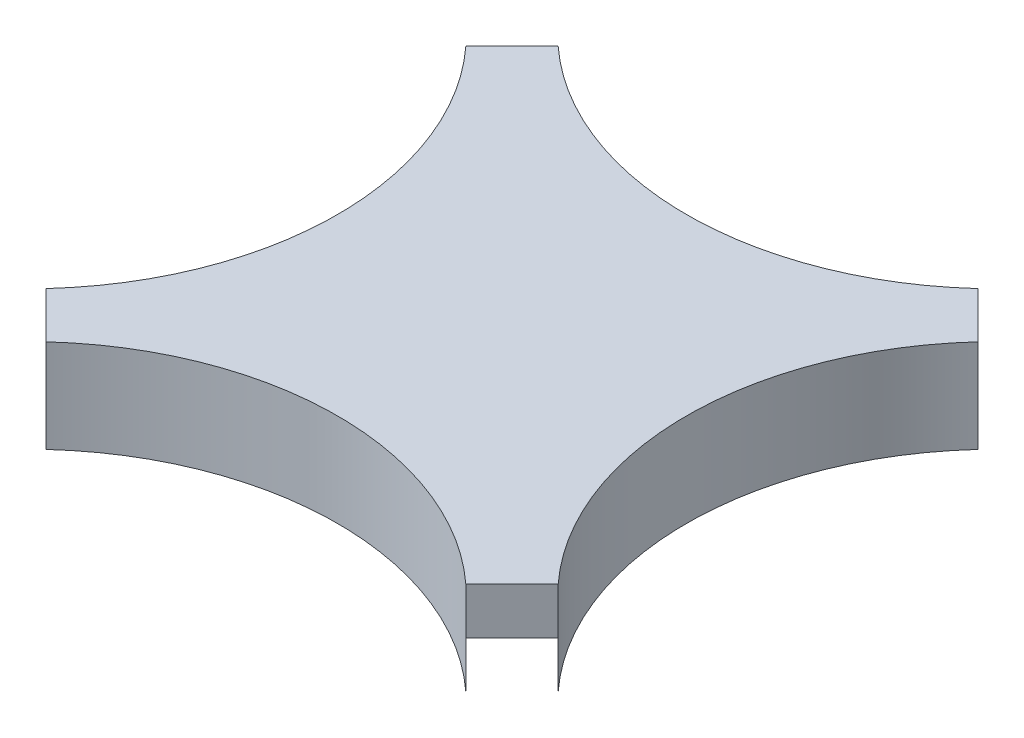
ISO-10303-21;
HEADER;
FILE_DESCRIPTION(('STEP AP214'),'2;1');
FILE_NAME('part.step','',(''),(''),'','','');
FILE_SCHEMA(('AUTOMOTIVE_DESIGN { 1 0 10303 214 1 1 1 1 }'));
ENDSEC;
DATA;
#1=APPLICATION_CONTEXT('core data for automotive mechanical design processes');
#2=APPLICATION_PROTOCOL_DEFINITION('international standard','automotive_design',2000,#1);
#3=PRODUCT_CONTEXT('',#1,'mechanical');
#4=PRODUCT('Part','Part','',(#3));
#5=PRODUCT_RELATED_PRODUCT_CATEGORY('part','',(#4));
#6=PRODUCT_DEFINITION_FORMATION('','',#4);
#7=PRODUCT_DEFINITION_CONTEXT('part definition',#1,'design');
#8=PRODUCT_DEFINITION('design','',#6,#7);
#9=PRODUCT_DEFINITION_SHAPE('','',#8);
#10=(LENGTH_UNIT() NAMED_UNIT(*) SI_UNIT(.MILLI.,.METRE.));
#11=(NAMED_UNIT(*) PLANE_ANGLE_UNIT() SI_UNIT($,.RADIAN.));
#12=(NAMED_UNIT(*) SI_UNIT($,.STERADIAN.) SOLID_ANGLE_UNIT());
#13=UNCERTAINTY_MEASURE_WITH_UNIT(LENGTH_MEASURE(1.E-05),#10,'distance_accuracy_value','');
#14=(GEOMETRIC_REPRESENTATION_CONTEXT(3) GLOBAL_UNCERTAINTY_ASSIGNED_CONTEXT((#13)) GLOBAL_UNIT_ASSIGNED_CONTEXT((#10,
#11,#12)) REPRESENTATION_CONTEXT('',''));
#15=CARTESIAN_POINT('',(0.,0.,0.));
#16=DIRECTION('',(0.,0.,1.));
#17=DIRECTION('',(1.,0.,0.));
#18=AXIS2_PLACEMENT_3D('',#15,#16,#17);
#19=CARTESIAN_POINT('',(-0.742462120245874,-1.5,-0.742462120245874));
#20=DIRECTION('',(0.707106781186548,0.,0.707106781186547));
#21=DIRECTION('',(0.707106781186547,0.,-0.707106781186548));
#22=AXIS2_PLACEMENT_3D('',#19,#20,#21);
#23=PLANE('',#22);
#24=DIRECTION('',(0.,1.,0.));
#25=VECTOR('',#24,1.);
#26=CARTESIAN_POINT('',(6.75753787975413,-1.5,-8.24246212024588));
#27=LINE('',#26,#25);
#28=CARTESIAN_POINT('',(6.75753787975413,-1.5,-8.24246212024588));
#29=VERTEX_POINT('',#28);
#30=CARTESIAN_POINT('',(6.75753787975413,0.,-8.24246212024588));
#31=VERTEX_POINT('',#30);
#32=EDGE_CURVE('E230',#29,#31,#27,.T.);
#33=ORIENTED_EDGE('',*,*,#32,.T.);
#34=DIRECTION('',(0.707106781186547,0.,-0.707106781186548));
#35=VECTOR('',#34,1.);
#36=CARTESIAN_POINT('',(-0.742462120245874,0.,-0.742462120245874));
#37=LINE('',#36,#35);
#38=CARTESIAN_POINT('',(2.27943567733269,0.,-3.76435991782444));
#39=VERTEX_POINT('',#38);
#40=EDGE_CURVE('E447',#39,#31,#37,.T.);
#41=ORIENTED_EDGE('',*,*,#40,.F.);
#42=DIRECTION('',(0.,1.,0.));
#43=VECTOR('',#42,1.);
#44=CARTESIAN_POINT('',(2.27943567733269,-1.5,-3.76435991782444));
#45=LINE('',#44,#43);
#46=CARTESIAN_POINT('',(2.27943567733269,-1.5,-3.76435991782444));
#47=VERTEX_POINT('',#46);
#48=EDGE_CURVE('E12',#47,#39,#45,.T.);
#49=ORIENTED_EDGE('',*,*,#48,.F.);
#50=DIRECTION('',(0.707106781186547,0.,-0.707106781186548));
#51=VECTOR('',#50,1.);
#52=CARTESIAN_POINT('',(-0.742462120245874,-1.5,-0.742462120245874));
#53=LINE('',#52,#51);
#54=EDGE_CURVE('E529',#47,#29,#53,.T.);
#55=ORIENTED_EDGE('',*,*,#54,.T.);
#56=EDGE_LOOP('',(#33,#41,#49,#55));
#57=FACE_BOUND('',#56,.T.);
#58=ADVANCED_FACE('F227',(#57),#23,.T.);
#59=CARTESIAN_POINT('',(0.,-1.5,-6.48588026367947));
#60=DIRECTION('',(0.,1.,0.));
#61=DIRECTION('',(0.,0.,1.));
#62=AXIS2_PLACEMENT_3D('',#59,#60,#61);
#63=CYLINDRICAL_SURFACE('',#62,3.55);
#64=CARTESIAN_POINT('',(0.,0.,-6.48588026367947));
#65=DIRECTION('',(0.,1.,0.));
#66=DIRECTION('',(0.,0.,1.));
#67=AXIS2_PLACEMENT_3D('',#64,#65,#66);
#68=CIRCLE('',#67,3.55);
#69=CARTESIAN_POINT('',(-2.27943567733269,0.,-3.76435991782444));
#70=VERTEX_POINT('',#69);
#71=EDGE_CURVE('E467',#39,#70,#68,.F.);
#72=ORIENTED_EDGE('',*,*,#71,.T.);
#73=DIRECTION('',(0.,1.,0.));
#74=VECTOR('',#73,1.);
#75=CARTESIAN_POINT('',(-2.27943567733269,-1.5,-3.76435991782444));
#76=LINE('',#75,#74);
#77=CARTESIAN_POINT('',(-2.27943567733269,-1.5,-3.76435991782444));
#78=VERTEX_POINT('',#77);
#79=EDGE_CURVE('E235',#78,#70,#76,.T.);
#80=ORIENTED_EDGE('',*,*,#79,.F.);
#81=CARTESIAN_POINT('',(0.,-1.5,-6.48588026367947));
#82=DIRECTION('',(0.,1.,0.));
#83=DIRECTION('',(0.,0.,1.));
#84=AXIS2_PLACEMENT_3D('',#81,#82,#83);
#85=CIRCLE('',#84,3.55);
#86=EDGE_CURVE('E248',#47,#78,#85,.F.);
#87=ORIENTED_EDGE('',*,*,#86,.F.);
#88=ORIENTED_EDGE('',*,*,#48,.T.);
#89=EDGE_LOOP('',(#72,#80,#87,#88));
#90=FACE_BOUND('',#89,.T.);
#91=ADVANCED_FACE('F556',(#90),#63,.T.);
#92=CARTESIAN_POINT('',(0.742462120245877,-1.5,-0.742462120245878));
#93=DIRECTION('',(-0.707106781186547,0.,0.707106781186548));
#94=DIRECTION('',(0.707106781186548,0.,0.707106781186547));
#95=AXIS2_PLACEMENT_3D('',#92,#93,#94);
#96=PLANE('',#95);
#97=ORIENTED_EDGE('',*,*,#79,.T.);
#98=DIRECTION('',(0.707106781186548,0.,0.707106781186547));
#99=VECTOR('',#98,1.);
#100=CARTESIAN_POINT('',(0.742462120245877,0.,-0.742462120245878));
#101=LINE('',#100,#99);
#102=CARTESIAN_POINT('',(-6.75753787975412,0.,-8.24246212024587));
#103=VERTEX_POINT('',#102);
#104=EDGE_CURVE('E470',#103,#70,#101,.T.);
#105=ORIENTED_EDGE('',*,*,#104,.F.);
#106=DIRECTION('',(0.,1.,0.));
#107=VECTOR('',#106,1.);
#108=CARTESIAN_POINT('',(-6.75753787975412,-1.5,-8.24246212024587));
#109=LINE('',#108,#107);
#110=CARTESIAN_POINT('',(-6.75753787975412,-1.5,-8.24246212024587));
#111=VERTEX_POINT('',#110);
#112=EDGE_CURVE('E539',#111,#103,#109,.T.);
#113=ORIENTED_EDGE('',*,*,#112,.F.);
#114=DIRECTION('',(0.707106781186548,0.,0.707106781186547));
#115=VECTOR('',#114,1.);
#116=CARTESIAN_POINT('',(0.742462120245877,-1.5,-0.742462120245878));
#117=LINE('',#116,#115);
#118=EDGE_CURVE('E534',#111,#78,#117,.T.);
#119=ORIENTED_EDGE('',*,*,#118,.T.);
#120=EDGE_LOOP('',(#97,#105,#113,#119));
#121=FACE_BOUND('',#120,.T.);
#122=ADVANCED_FACE('F549',(#121),#96,.T.);
#123=CARTESIAN_POINT('',(0.,-1.5,-15.6137362166072));
#124=DIRECTION('',(0.,1.,0.));
#125=DIRECTION('',(0.,0.,1.));
#126=AXIS2_PLACEMENT_3D('',#123,#124,#125);
#127=CYLINDRICAL_SURFACE('',#126,10.);
#128=ORIENTED_EDGE('',*,*,#112,.T.);
#129=DIRECTION('',(0.,-1.,0.));
#130=VECTOR('',#129,1.);
#131=CARTESIAN_POINT('',(-6.75753787975412,1.5,-8.24246212024587));
#132=LINE('',#131,#130);
#133=CARTESIAN_POINT('',(-6.75753787975412,1.5,-8.24246212024587));
#134=VERTEX_POINT('',#133);
#135=EDGE_CURVE('E524',#134,#103,#132,.T.);
#136=ORIENTED_EDGE('',*,*,#135,.F.);
#137=CARTESIAN_POINT('',(0.,1.5,-15.6137362166072));
#138=DIRECTION('',(0.,1.,0.));
#139=DIRECTION('',(0.,0.,1.));
#140=AXIS2_PLACEMENT_3D('',#137,#138,#139);
#141=CIRCLE('',#140,10.);
#142=CARTESIAN_POINT('',(6.75753787975413,1.5,-8.24246212024588));
#143=VERTEX_POINT('',#142);
#144=EDGE_CURVE('E526',#143,#134,#141,.F.);
#145=ORIENTED_EDGE('',*,*,#144,.F.);
#146=DIRECTION('',(0.,-1.,0.));
#147=VECTOR('',#146,1.);
#148=CARTESIAN_POINT('',(6.75753787975413,1.5,-8.24246212024588));
#149=LINE('',#148,#147);
#150=EDGE_CURVE('E465',#143,#31,#149,.T.);
#151=ORIENTED_EDGE('',*,*,#150,.T.);
#152=ORIENTED_EDGE('',*,*,#32,.F.);
#153=CARTESIAN_POINT('',(0.,-1.5,-15.6137362166072));
#154=DIRECTION('',(0.,1.,0.));
#155=DIRECTION('',(0.,0.,1.));
#156=AXIS2_PLACEMENT_3D('',#153,#154,#155);
#157=CIRCLE('',#156,10.);
#158=EDGE_CURVE('E531',#29,#111,#157,.F.);
#159=ORIENTED_EDGE('',*,*,#158,.T.);
#160=EDGE_LOOP('',(#128,#136,#145,#151,#152,#159));
#161=FACE_BOUND('',#160,.T.);
#162=ADVANCED_FACE('F545',(#161),#127,.F.);
#163=CARTESIAN_POINT('',(0.,-1.5,0.));
#164=DIRECTION('',(0.,1.,0.));
#165=DIRECTION('',(0.,0.,1.));
#166=AXIS2_PLACEMENT_3D('',#163,#164,#165);
#167=PLANE('',#166);
#168=ORIENTED_EDGE('',*,*,#54,.F.);
#169=ORIENTED_EDGE('',*,*,#86,.T.);
#170=ORIENTED_EDGE('',*,*,#118,.F.);
#171=ORIENTED_EDGE('',*,*,#158,.F.);
#172=EDGE_LOOP('',(#168,#169,#170,#171));
#173=FACE_BOUND('',#172,.T.);
#174=ADVANCED_FACE('F547',(#173),#167,.F.);
#175=CARTESIAN_POINT('',(0.,1.5,0.));
#176=DIRECTION('',(0.,1.,0.));
#177=DIRECTION('',(0.,0.,1.));
#178=AXIS2_PLACEMENT_3D('',#175,#176,#177);
#179=PLANE('',#178);
#180=DIRECTION('',(-0.707106781186547,0.,0.707106781186548));
#181=VECTOR('',#180,1.);
#182=CARTESIAN_POINT('',(7.50000000000001,1.5,7.5));
#183=LINE('',#182,#181);
#184=CARTESIAN_POINT('',(8.24246212024588,1.5,6.75753787975413));
#185=VERTEX_POINT('',#184);
#186=CARTESIAN_POINT('',(6.75753787975413,1.5,8.24246212024588));
#187=VERTEX_POINT('',#186);
#188=EDGE_CURVE('E461',#185,#187,#183,.T.);
#189=ORIENTED_EDGE('',*,*,#188,.F.);
#190=CARTESIAN_POINT('',(15.6137362166072,1.5,0.));
#191=DIRECTION('',(0.,1.,0.));
#192=DIRECTION('',(0.,0.,1.));
#193=AXIS2_PLACEMENT_3D('',#190,#191,#192);
#194=CIRCLE('',#193,10.);
#195=CARTESIAN_POINT('',(8.24246212024588,1.5,-6.75753787975413));
#196=VERTEX_POINT('',#195);
#197=EDGE_CURVE('E392',#185,#196,#194,.F.);
#198=ORIENTED_EDGE('',*,*,#197,.T.);
#199=DIRECTION('',(0.707106781186548,0.,0.707106781186547));
#200=VECTOR('',#199,1.);
#201=CARTESIAN_POINT('',(7.5,1.5,-7.50000000000001));
#202=LINE('',#201,#200);
#203=EDGE_CURVE('E463',#143,#196,#202,.T.);
#204=ORIENTED_EDGE('',*,*,#203,.F.);
#205=ORIENTED_EDGE('',*,*,#144,.T.);
#206=DIRECTION('',(0.707106781186548,0.,-0.707106781186548));
#207=VECTOR('',#206,1.);
#208=CARTESIAN_POINT('',(-7.5,1.5,-7.5));
#209=LINE('',#208,#207);
#210=CARTESIAN_POINT('',(-8.24246212024587,1.5,-6.75753787975412));
#211=VERTEX_POINT('',#210);
#212=EDGE_CURVE('E455',#211,#134,#209,.T.);
#213=ORIENTED_EDGE('',*,*,#212,.F.);
#214=CARTESIAN_POINT('',(-15.6137362166072,1.5,0.));
#215=DIRECTION('',(0.,1.,0.));
#216=DIRECTION('',(0.,0.,1.));
#217=AXIS2_PLACEMENT_3D('',#214,#215,#216);
#218=CIRCLE('',#217,10.);
#219=CARTESIAN_POINT('',(-8.24246212024587,1.5,6.75753787975413));
#220=VERTEX_POINT('',#219);
#221=EDGE_CURVE('E421',#211,#220,#218,.F.);
#222=ORIENTED_EDGE('',*,*,#221,.T.);
#223=DIRECTION('',(-0.707106781186548,0.,-0.707106781186547));
#224=VECTOR('',#223,1.);
#225=CARTESIAN_POINT('',(-7.5,1.5,7.5));
#226=LINE('',#225,#224);
#227=CARTESIAN_POINT('',(-6.75753787975412,1.5,8.24246212024588));
#228=VERTEX_POINT('',#227);
#229=EDGE_CURVE('E457',#228,#220,#226,.T.);
#230=ORIENTED_EDGE('',*,*,#229,.F.);
#231=CARTESIAN_POINT('',(0.,1.5,15.6137362166072));
#232=DIRECTION('',(0.,1.,0.));
#233=DIRECTION('',(0.,0.,1.));
#234=AXIS2_PLACEMENT_3D('',#231,#232,#233);
#235=CIRCLE('',#234,10.);
#236=EDGE_CURVE('E400',#228,#187,#235,.F.);
#237=ORIENTED_EDGE('',*,*,#236,.T.);
#238=EDGE_LOOP('',(#189,#198,#204,#205,#213,#222,#230,#237));
#239=FACE_BOUND('',#238,.T.);
#240=ADVANCED_FACE('F570',(#239),#179,.T.);
#241=CARTESIAN_POINT('',(-7.5,1.5,-7.5));
#242=DIRECTION('',(-0.707106781186547,0.,-0.707106781186547));
#243=DIRECTION('',(-0.707106781186548,0.,0.707106781186548));
#244=AXIS2_PLACEMENT_3D('',#241,#242,#243);
#245=PLANE('',#244);
#246=DIRECTION('',(0.707106781186548,0.,-0.707106781186548));
#247=VECTOR('',#246,1.);
#248=CARTESIAN_POINT('',(-7.5,0.,-7.5));
#249=LINE('',#248,#247);
#250=CARTESIAN_POINT('',(-8.24246212024587,0.,-6.75753787975412));
#251=VERTEX_POINT('',#250);
#252=EDGE_CURVE('E472',#251,#103,#249,.T.);
#253=ORIENTED_EDGE('',*,*,#252,.F.);
#254=DIRECTION('',(0.,-1.,0.));
#255=VECTOR('',#254,1.);
#256=CARTESIAN_POINT('',(-8.24246212024587,1.5,-6.75753787975412));
#257=LINE('',#256,#255);
#258=EDGE_CURVE('E522',#211,#251,#257,.T.);
#259=ORIENTED_EDGE('',*,*,#258,.F.);
#260=ORIENTED_EDGE('',*,*,#212,.T.);
#261=ORIENTED_EDGE('',*,*,#135,.T.);
#262=EDGE_LOOP('',(#253,#259,#260,#261));
#263=FACE_BOUND('',#262,.T.);
#264=ADVANCED_FACE('F574',(#263),#245,.T.);
#265=CARTESIAN_POINT('',(-7.5,1.5,7.5));
#266=DIRECTION('',(-0.707106781186547,0.,0.707106781186548));
#267=DIRECTION('',(0.707106781186548,0.,0.707106781186547));
#268=AXIS2_PLACEMENT_3D('',#265,#266,#267);
#269=PLANE('',#268);
#270=DIRECTION('',(-0.707106781186548,0.,-0.707106781186547));
#271=VECTOR('',#270,1.);
#272=CARTESIAN_POINT('',(-7.5,0.,7.5));
#273=LINE('',#272,#271);
#274=CARTESIAN_POINT('',(-6.75753787975412,0.,8.24246212024588));
#275=VERTEX_POINT('',#274);
#276=CARTESIAN_POINT('',(-8.24246212024587,0.,6.75753787975413));
#277=VERTEX_POINT('',#276);
#278=EDGE_CURVE('E483',#275,#277,#273,.T.);
#279=ORIENTED_EDGE('',*,*,#278,.F.);
#280=DIRECTION('',(0.,-1.,0.));
#281=VECTOR('',#280,1.);
#282=CARTESIAN_POINT('',(-6.75753787975412,1.5,8.24246212024588));
#283=LINE('',#282,#281);
#284=EDGE_CURVE('E516',#228,#275,#283,.T.);
#285=ORIENTED_EDGE('',*,*,#284,.F.);
#286=ORIENTED_EDGE('',*,*,#229,.T.);
#287=DIRECTION('',(0.,-1.,0.));
#288=VECTOR('',#287,1.);
#289=CARTESIAN_POINT('',(-8.24246212024587,1.5,6.75753787975413));
#290=LINE('',#289,#288);
#291=EDGE_CURVE('E519',#220,#277,#290,.T.);
#292=ORIENTED_EDGE('',*,*,#291,.T.);
#293=EDGE_LOOP('',(#279,#285,#286,#292));
#294=FACE_BOUND('',#293,.T.);
#295=ADVANCED_FACE('F579',(#294),#269,.T.);
#296=CARTESIAN_POINT('',(7.50000000000001,1.5,7.5));
#297=DIRECTION('',(0.707106781186548,0.,0.707106781186547));
#298=DIRECTION('',(0.707106781186547,0.,-0.707106781186548));
#299=AXIS2_PLACEMENT_3D('',#296,#297,#298);
#300=PLANE('',#299);
#301=DIRECTION('',(-0.707106781186547,0.,0.707106781186548));
#302=VECTOR('',#301,1.);
#303=CARTESIAN_POINT('',(7.50000000000001,0.,7.5));
#304=LINE('',#303,#302);
#305=CARTESIAN_POINT('',(8.24246212024588,0.,6.75753787975413));
#306=VERTEX_POINT('',#305);
#307=CARTESIAN_POINT('',(6.75753787975413,0.,8.24246212024588));
#308=VERTEX_POINT('',#307);
#309=EDGE_CURVE('E495',#306,#308,#304,.T.);
#310=ORIENTED_EDGE('',*,*,#309,.F.);
#311=DIRECTION('',(0.,-1.,0.));
#312=VECTOR('',#311,1.);
#313=CARTESIAN_POINT('',(8.24246212024588,1.5,6.75753787975413));
#314=LINE('',#313,#312);
#315=EDGE_CURVE('E373',#185,#306,#314,.T.);
#316=ORIENTED_EDGE('',*,*,#315,.F.);
#317=ORIENTED_EDGE('',*,*,#188,.T.);
#318=DIRECTION('',(0.,-1.,0.));
#319=VECTOR('',#318,1.);
#320=CARTESIAN_POINT('',(6.75753787975413,1.5,8.24246212024588));
#321=LINE('',#320,#319);
#322=EDGE_CURVE('E513',#187,#308,#321,.T.);
#323=ORIENTED_EDGE('',*,*,#322,.T.);
#324=EDGE_LOOP('',(#310,#316,#317,#323));
#325=FACE_BOUND('',#324,.T.);
#326=ADVANCED_FACE('F586',(#325),#300,.T.);
#327=CARTESIAN_POINT('',(7.5,1.5,-7.50000000000001));
#328=DIRECTION('',(0.707106781186547,0.,-0.707106781186548));
#329=DIRECTION('',(-0.707106781186548,0.,-0.707106781186547));
#330=AXIS2_PLACEMENT_3D('',#327,#328,#329);
#331=PLANE('',#330);
#332=DIRECTION('',(0.707106781186548,0.,0.707106781186547));
#333=VECTOR('',#332,1.);
#334=CARTESIAN_POINT('',(7.5,0.,-7.50000000000001));
#335=LINE('',#334,#333);
#336=CARTESIAN_POINT('',(8.24246212024588,0.,-6.75753787975413));
#337=VERTEX_POINT('',#336);
#338=EDGE_CURVE('E458',#31,#337,#335,.T.);
#339=ORIENTED_EDGE('',*,*,#338,.F.);
#340=ORIENTED_EDGE('',*,*,#150,.F.);
#341=ORIENTED_EDGE('',*,*,#203,.T.);
#342=DIRECTION('',(0.,-1.,0.));
#343=VECTOR('',#342,1.);
#344=CARTESIAN_POINT('',(8.24246212024588,1.5,-6.75753787975413));
#345=LINE('',#344,#343);
#346=EDGE_CURVE('E509',#196,#337,#345,.T.);
#347=ORIENTED_EDGE('',*,*,#346,.T.);
#348=EDGE_LOOP('',(#339,#340,#341,#347));
#349=FACE_BOUND('',#348,.T.);
#350=ADVANCED_FACE('F590',(#349),#331,.T.);
#351=CARTESIAN_POINT('',(0.,0.,0.));
#352=DIRECTION('',(0.,1.,0.));
#353=DIRECTION('',(0.,0.,1.));
#354=AXIS2_PLACEMENT_3D('',#351,#352,#353);
#355=PLANE('',#354);
#356=ORIENTED_EDGE('',*,*,#40,.T.);
#357=ORIENTED_EDGE('',*,*,#338,.T.);
#358=DIRECTION('',(0.707106781186547,0.,-0.707106781186548));
#359=VECTOR('',#358,1.);
#360=CARTESIAN_POINT('',(0.742462120245877,0.,0.742462120245877));
#361=LINE('',#360,#359);
#362=CARTESIAN_POINT('',(3.76435991782444,0.,-2.27943567733269));
#363=VERTEX_POINT('',#362);
#364=EDGE_CURVE('E503',#363,#337,#361,.T.);
#365=ORIENTED_EDGE('',*,*,#364,.F.);
#366=CARTESIAN_POINT('',(6.48588026367947,0.,0.));
#367=DIRECTION('',(0.,1.,0.));
#368=DIRECTION('',(0.,0.,1.));
#369=AXIS2_PLACEMENT_3D('',#366,#367,#368);
#370=CIRCLE('',#369,3.55);
#371=CARTESIAN_POINT('',(3.76435991782444,0.,2.27943567733269));
#372=VERTEX_POINT('',#371);
#373=EDGE_CURVE('E500',#372,#363,#370,.F.);
#374=ORIENTED_EDGE('',*,*,#373,.F.);
#375=DIRECTION('',(0.707106781186548,0.,0.707106781186547));
#376=VECTOR('',#375,1.);
#377=CARTESIAN_POINT('',(0.742462120245875,0.,-0.742462120245875));
#378=LINE('',#377,#376);
#379=EDGE_CURVE('E497',#372,#306,#378,.T.);
#380=ORIENTED_EDGE('',*,*,#379,.T.);
#381=ORIENTED_EDGE('',*,*,#309,.T.);
#382=DIRECTION('',(0.707106781186548,0.,0.707106781186547));
#383=VECTOR('',#382,1.);
#384=CARTESIAN_POINT('',(-0.742462120245876,0.,0.742462120245876));
#385=LINE('',#384,#383);
#386=CARTESIAN_POINT('',(2.27943567733269,0.,3.76435991782444));
#387=VERTEX_POINT('',#386);
#388=EDGE_CURVE('E492',#387,#308,#385,.T.);
#389=ORIENTED_EDGE('',*,*,#388,.F.);
#390=CARTESIAN_POINT('',(0.,0.,6.48588026367947));
#391=DIRECTION('',(0.,1.,0.));
#392=DIRECTION('',(0.,0.,1.));
#393=AXIS2_PLACEMENT_3D('',#390,#391,#392);
#394=CIRCLE('',#393,3.55);
#395=CARTESIAN_POINT('',(-2.27943567733269,0.,3.76435991782444));
#396=VERTEX_POINT('',#395);
#397=EDGE_CURVE('E489',#396,#387,#394,.F.);
#398=ORIENTED_EDGE('',*,*,#397,.F.);
#399=DIRECTION('',(0.707106781186547,0.,-0.707106781186548));
#400=VECTOR('',#399,1.);
#401=CARTESIAN_POINT('',(0.742462120245874,0.,0.742462120245874));
#402=LINE('',#401,#400);
#403=EDGE_CURVE('E486',#275,#396,#402,.T.);
#404=ORIENTED_EDGE('',*,*,#403,.F.);
#405=ORIENTED_EDGE('',*,*,#278,.T.);
#406=DIRECTION('',(0.707106781186547,0.,-0.707106781186548));
#407=VECTOR('',#406,1.);
#408=CARTESIAN_POINT('',(-0.742462120245876,0.,-0.742462120245876));
#409=LINE('',#408,#407);
#410=CARTESIAN_POINT('',(-3.76435991782444,0.,2.27943567733269));
#411=VERTEX_POINT('',#410);
#412=EDGE_CURVE('E480',#277,#411,#409,.T.);
#413=ORIENTED_EDGE('',*,*,#412,.T.);
#414=CARTESIAN_POINT('',(-6.48588026367946,0.,0.));
#415=DIRECTION('',(0.,1.,0.));
#416=DIRECTION('',(0.,0.,1.));
#417=AXIS2_PLACEMENT_3D('',#414,#415,#416);
#418=CIRCLE('',#417,3.55);
#419=CARTESIAN_POINT('',(-3.76435991782444,0.,-2.27943567733269));
#420=VERTEX_POINT('',#419);
#421=EDGE_CURVE('E477',#420,#411,#418,.F.);
#422=ORIENTED_EDGE('',*,*,#421,.F.);
#423=DIRECTION('',(0.707106781186548,0.,0.707106781186547));
#424=VECTOR('',#423,1.);
#425=CARTESIAN_POINT('',(-0.742462120245873,0.,0.742462120245874));
#426=LINE('',#425,#424);
#427=EDGE_CURVE('E475',#251,#420,#426,.T.);
#428=ORIENTED_EDGE('',*,*,#427,.F.);
#429=ORIENTED_EDGE('',*,*,#252,.T.);
#430=ORIENTED_EDGE('',*,*,#104,.T.);
#431=ORIENTED_EDGE('',*,*,#71,.F.);
#432=EDGE_LOOP('',(#356,#357,#365,#374,#380,#381,#389,#398,#404,#405,#413,#422,#428,#429,#430,#431));
#433=FACE_BOUND('',#432,.T.);
#434=ADVANCED_FACE('F552',(#433),#355,.F.);
#435=CARTESIAN_POINT('',(-0.742462120245873,-1.5,0.742462120245874));
#436=DIRECTION('',(-0.707106781186547,0.,0.707106781186548));
#437=DIRECTION('',(0.707106781186548,0.,0.707106781186547));
#438=AXIS2_PLACEMENT_3D('',#435,#436,#437);
#439=PLANE('',#438);
#440=DIRECTION('',(0.,1.,0.));
#441=VECTOR('',#440,1.);
#442=CARTESIAN_POINT('',(-8.24246212024587,-1.5,-6.75753787975412));
#443=LINE('',#442,#441);
#444=CARTESIAN_POINT('',(-8.24246212024587,-1.5,-6.75753787975412));
#445=VERTEX_POINT('',#444);
#446=EDGE_CURVE('E443',#445,#251,#443,.T.);
#447=ORIENTED_EDGE('',*,*,#446,.T.);
#448=ORIENTED_EDGE('',*,*,#427,.T.);
#449=DIRECTION('',(0.,1.,0.));
#450=VECTOR('',#449,1.);
#451=CARTESIAN_POINT('',(-3.76435991782444,-1.5,-2.27943567733269));
#452=LINE('',#451,#450);
#453=CARTESIAN_POINT('',(-3.76435991782444,-1.5,-2.27943567733269));
#454=VERTEX_POINT('',#453);
#455=EDGE_CURVE('E444',#454,#420,#452,.T.);
#456=ORIENTED_EDGE('',*,*,#455,.F.);
#457=DIRECTION('',(0.707106781186548,0.,0.707106781186547));
#458=VECTOR('',#457,1.);
#459=CARTESIAN_POINT('',(-0.742462120245873,-1.5,0.742462120245874));
#460=LINE('',#459,#458);
#461=EDGE_CURVE('E432',#445,#454,#460,.T.);
#462=ORIENTED_EDGE('',*,*,#461,.F.);
#463=EDGE_LOOP('',(#447,#448,#456,#462));
#464=FACE_BOUND('',#463,.T.);
#465=ADVANCED_FACE('F597',(#464),#439,.F.);
#466=CARTESIAN_POINT('',(-6.48588026367946,-1.5,0.));
#467=DIRECTION('',(0.,1.,0.));
#468=DIRECTION('',(0.,0.,1.));
#469=AXIS2_PLACEMENT_3D('',#466,#467,#468);
#470=CYLINDRICAL_SURFACE('',#469,3.55);
#471=ORIENTED_EDGE('',*,*,#455,.T.);
#472=ORIENTED_EDGE('',*,*,#421,.T.);
#473=DIRECTION('',(0.,1.,0.));
#474=VECTOR('',#473,1.);
#475=CARTESIAN_POINT('',(-3.76435991782444,-1.5,2.27943567733269));
#476=LINE('',#475,#474);
#477=CARTESIAN_POINT('',(-3.76435991782444,-1.5,2.27943567733269));
#478=VERTEX_POINT('',#477);
#479=EDGE_CURVE('E448',#478,#411,#476,.T.);
#480=ORIENTED_EDGE('',*,*,#479,.F.);
#481=CARTESIAN_POINT('',(-6.48588026367946,-1.5,0.));
#482=DIRECTION('',(0.,1.,0.));
#483=DIRECTION('',(0.,0.,1.));
#484=AXIS2_PLACEMENT_3D('',#481,#482,#483);
#485=CIRCLE('',#484,3.55);
#486=EDGE_CURVE('E441',#454,#478,#485,.F.);
#487=ORIENTED_EDGE('',*,*,#486,.F.);
#488=EDGE_LOOP('',(#471,#472,#480,#487));
#489=FACE_BOUND('',#488,.T.);
#490=ADVANCED_FACE('F600',(#489),#470,.T.);
#491=CARTESIAN_POINT('',(-0.742462120245876,-1.5,-0.742462120245876));
#492=DIRECTION('',(0.707106781186548,0.,0.707106781186547));
#493=DIRECTION('',(0.707106781186547,0.,-0.707106781186548));
#494=AXIS2_PLACEMENT_3D('',#491,#492,#493);
#495=PLANE('',#494);
#496=ORIENTED_EDGE('',*,*,#412,.F.);
#497=DIRECTION('',(0.,1.,0.));
#498=VECTOR('',#497,1.);
#499=CARTESIAN_POINT('',(-8.24246212024587,-1.5,6.75753787975413));
#500=LINE('',#499,#498);
#501=CARTESIAN_POINT('',(-8.24246212024587,-1.5,6.75753787975413));
#502=VERTEX_POINT('',#501);
#503=EDGE_CURVE('E450',#502,#277,#500,.T.);
#504=ORIENTED_EDGE('',*,*,#503,.F.);
#505=DIRECTION('',(0.707106781186547,0.,-0.707106781186548));
#506=VECTOR('',#505,1.);
#507=CARTESIAN_POINT('',(-0.742462120245876,-1.5,-0.742462120245876));
#508=LINE('',#507,#506);
#509=EDGE_CURVE('E438',#502,#478,#508,.T.);
#510=ORIENTED_EDGE('',*,*,#509,.T.);
#511=ORIENTED_EDGE('',*,*,#479,.T.);
#512=EDGE_LOOP('',(#496,#504,#510,#511));
#513=FACE_BOUND('',#512,.T.);
#514=ADVANCED_FACE('F606',(#513),#495,.T.);
#515=CARTESIAN_POINT('',(-15.6137362166072,-1.5,0.));
#516=DIRECTION('',(0.,1.,0.));
#517=DIRECTION('',(0.,0.,1.));
#518=AXIS2_PLACEMENT_3D('',#515,#516,#517);
#519=CYLINDRICAL_SURFACE('',#518,10.);
#520=ORIENTED_EDGE('',*,*,#503,.T.);
#521=ORIENTED_EDGE('',*,*,#291,.F.);
#522=ORIENTED_EDGE('',*,*,#221,.F.);
#523=ORIENTED_EDGE('',*,*,#258,.T.);
#524=ORIENTED_EDGE('',*,*,#446,.F.);
#525=CARTESIAN_POINT('',(-15.6137362166072,-1.5,0.));
#526=DIRECTION('',(0.,1.,0.));
#527=DIRECTION('',(0.,0.,1.));
#528=AXIS2_PLACEMENT_3D('',#525,#526,#527);
#529=CIRCLE('',#528,10.);
#530=EDGE_CURVE('E435',#445,#502,#529,.F.);
#531=ORIENTED_EDGE('',*,*,#530,.T.);
#532=EDGE_LOOP('',(#520,#521,#522,#523,#524,#531));
#533=FACE_BOUND('',#532,.T.);
#534=ADVANCED_FACE('F602',(#533),#519,.F.);
#535=CARTESIAN_POINT('',(0.,-1.5,0.));
#536=DIRECTION('',(0.,1.,0.));
#537=DIRECTION('',(0.,0.,1.));
#538=AXIS2_PLACEMENT_3D('',#535,#536,#537);
#539=PLANE('',#538);
#540=ORIENTED_EDGE('',*,*,#461,.T.);
#541=ORIENTED_EDGE('',*,*,#486,.T.);
#542=ORIENTED_EDGE('',*,*,#509,.F.);
#543=ORIENTED_EDGE('',*,*,#530,.F.);
#544=EDGE_LOOP('',(#540,#541,#542,#543));
#545=FACE_BOUND('',#544,.T.);
#546=ADVANCED_FACE('F605',(#545),#539,.F.);
#547=CARTESIAN_POINT('',(0.742462120245874,-1.5,0.742462120245874));
#548=DIRECTION('',(0.707106781186548,0.,0.707106781186547));
#549=DIRECTION('',(0.707106781186547,0.,-0.707106781186548));
#550=AXIS2_PLACEMENT_3D('',#547,#548,#549);
#551=PLANE('',#550);
#552=DIRECTION('',(0.,1.,0.));
#553=VECTOR('',#552,1.);
#554=CARTESIAN_POINT('',(-6.75753787975412,-1.5,8.24246212024588));
#555=LINE('',#554,#553);
#556=CARTESIAN_POINT('',(-6.75753787975412,-1.5,8.24246212024588));
#557=VERTEX_POINT('',#556);
#558=EDGE_CURVE('E417',#557,#275,#555,.T.);
#559=ORIENTED_EDGE('',*,*,#558,.T.);
#560=ORIENTED_EDGE('',*,*,#403,.T.);
#561=DIRECTION('',(0.,1.,0.));
#562=VECTOR('',#561,1.);
#563=CARTESIAN_POINT('',(-2.27943567733269,-1.5,3.76435991782444));
#564=LINE('',#563,#562);
#565=CARTESIAN_POINT('',(-2.27943567733269,-1.5,3.76435991782444));
#566=VERTEX_POINT('',#565);
#567=EDGE_CURVE('E418',#566,#396,#564,.T.);
#568=ORIENTED_EDGE('',*,*,#567,.F.);
#569=DIRECTION('',(0.707106781186547,0.,-0.707106781186548));
#570=VECTOR('',#569,1.);
#571=CARTESIAN_POINT('',(0.742462120245874,-1.5,0.742462120245874));
#572=LINE('',#571,#570);
#573=EDGE_CURVE('E407',#557,#566,#572,.T.);
#574=ORIENTED_EDGE('',*,*,#573,.F.);
#575=EDGE_LOOP('',(#559,#560,#568,#574));
#576=FACE_BOUND('',#575,.T.);
#577=ADVANCED_FACE('F616',(#576),#551,.F.);
#578=CARTESIAN_POINT('',(0.,-1.5,6.48588026367947));
#579=DIRECTION('',(0.,1.,0.));
#580=DIRECTION('',(0.,0.,1.));
#581=AXIS2_PLACEMENT_3D('',#578,#579,#580);
#582=CYLINDRICAL_SURFACE('',#581,3.55);
#583=ORIENTED_EDGE('',*,*,#567,.T.);
#584=ORIENTED_EDGE('',*,*,#397,.T.);
#585=DIRECTION('',(0.,1.,0.));
#586=VECTOR('',#585,1.);
#587=CARTESIAN_POINT('',(2.27943567733269,-1.5,3.76435991782444));
#588=LINE('',#587,#586);
#589=CARTESIAN_POINT('',(2.27943567733269,-1.5,3.76435991782444));
#590=VERTEX_POINT('',#589);
#591=EDGE_CURVE('E422',#590,#387,#588,.T.);
#592=ORIENTED_EDGE('',*,*,#591,.F.);
#593=CARTESIAN_POINT('',(0.,-1.5,6.48588026367947));
#594=DIRECTION('',(0.,1.,0.));
#595=DIRECTION('',(0.,0.,1.));
#596=AXIS2_PLACEMENT_3D('',#593,#594,#595);
#597=CIRCLE('',#596,3.55);
#598=EDGE_CURVE('E415',#566,#590,#597,.F.);
#599=ORIENTED_EDGE('',*,*,#598,.F.);
#600=EDGE_LOOP('',(#583,#584,#592,#599));
#601=FACE_BOUND('',#600,.T.);
#602=ADVANCED_FACE('F620',(#601),#582,.T.);
#603=CARTESIAN_POINT('',(-0.742462120245876,-1.5,0.742462120245876));
#604=DIRECTION('',(-0.707106781186547,0.,0.707106781186548));
#605=DIRECTION('',(0.707106781186548,0.,0.707106781186547));
#606=AXIS2_PLACEMENT_3D('',#603,#604,#605);
#607=PLANE('',#606);
#608=ORIENTED_EDGE('',*,*,#591,.T.);
#609=ORIENTED_EDGE('',*,*,#388,.T.);
#610=DIRECTION('',(0.,1.,0.));
#611=VECTOR('',#610,1.);
#612=CARTESIAN_POINT('',(6.75753787975413,-1.5,8.24246212024588));
#613=LINE('',#612,#611);
#614=CARTESIAN_POINT('',(6.75753787975413,-1.5,8.24246212024588));
#615=VERTEX_POINT('',#614);
#616=EDGE_CURVE('E425',#615,#308,#613,.T.);
#617=ORIENTED_EDGE('',*,*,#616,.F.);
#618=DIRECTION('',(0.707106781186548,0.,0.707106781186547));
#619=VECTOR('',#618,1.);
#620=CARTESIAN_POINT('',(-0.742462120245876,-1.5,0.742462120245876));
#621=LINE('',#620,#619);
#622=EDGE_CURVE('E413',#590,#615,#621,.T.);
#623=ORIENTED_EDGE('',*,*,#622,.F.);
#624=EDGE_LOOP('',(#608,#609,#617,#623));
#625=FACE_BOUND('',#624,.T.);
#626=ADVANCED_FACE('F626',(#625),#607,.F.);
#627=CARTESIAN_POINT('',(0.,-1.5,15.6137362166072));
#628=DIRECTION('',(0.,1.,0.));
#629=DIRECTION('',(0.,0.,1.));
#630=AXIS2_PLACEMENT_3D('',#627,#628,#629);
#631=CYLINDRICAL_SURFACE('',#630,10.);
#632=ORIENTED_EDGE('',*,*,#616,.T.);
#633=ORIENTED_EDGE('',*,*,#322,.F.);
#634=ORIENTED_EDGE('',*,*,#236,.F.);
#635=ORIENTED_EDGE('',*,*,#284,.T.);
#636=ORIENTED_EDGE('',*,*,#558,.F.);
#637=CARTESIAN_POINT('',(0.,-1.5,15.6137362166072));
#638=DIRECTION('',(0.,1.,0.));
#639=DIRECTION('',(0.,0.,1.));
#640=AXIS2_PLACEMENT_3D('',#637,#638,#639);
#641=CIRCLE('',#640,10.);
#642=EDGE_CURVE('E410',#557,#615,#641,.F.);
#643=ORIENTED_EDGE('',*,*,#642,.T.);
#644=EDGE_LOOP('',(#632,#633,#634,#635,#636,#643));
#645=FACE_BOUND('',#644,.T.);
#646=ADVANCED_FACE('F622',(#645),#631,.F.);
#647=CARTESIAN_POINT('',(0.,-1.5,0.));
#648=DIRECTION('',(0.,1.,0.));
#649=DIRECTION('',(0.,0.,1.));
#650=AXIS2_PLACEMENT_3D('',#647,#648,#649);
#651=PLANE('',#650);
#652=ORIENTED_EDGE('',*,*,#573,.T.);
#653=ORIENTED_EDGE('',*,*,#598,.T.);
#654=ORIENTED_EDGE('',*,*,#622,.T.);
#655=ORIENTED_EDGE('',*,*,#642,.F.);
#656=EDGE_LOOP('',(#652,#653,#654,#655));
#657=FACE_BOUND('',#656,.T.);
#658=ADVANCED_FACE('F625',(#657),#651,.F.);
#659=CARTESIAN_POINT('',(0.742462120245875,-1.5,-0.742462120245875));
#660=DIRECTION('',(-0.707106781186547,0.,0.707106781186548));
#661=DIRECTION('',(0.707106781186548,0.,0.707106781186547));
#662=AXIS2_PLACEMENT_3D('',#659,#660,#661);
#663=PLANE('',#662);
#664=ORIENTED_EDGE('',*,*,#379,.F.);
#665=DIRECTION('',(0.,1.,0.));
#666=VECTOR('',#665,1.);
#667=CARTESIAN_POINT('',(3.76435991782444,-1.5,2.27943567733269));
#668=LINE('',#667,#666);
#669=CARTESIAN_POINT('',(3.76435991782444,-1.5,2.27943567733269));
#670=VERTEX_POINT('',#669);
#671=EDGE_CURVE('E390',#670,#372,#668,.T.);
#672=ORIENTED_EDGE('',*,*,#671,.F.);
#673=DIRECTION('',(0.707106781186548,0.,0.707106781186547));
#674=VECTOR('',#673,1.);
#675=CARTESIAN_POINT('',(0.742462120245875,-1.5,-0.742462120245875));
#676=LINE('',#675,#674);
#677=CARTESIAN_POINT('',(8.24246212024588,-1.5,6.75753787975413));
#678=VERTEX_POINT('',#677);
#679=EDGE_CURVE('E383',#670,#678,#676,.T.);
#680=ORIENTED_EDGE('',*,*,#679,.T.);
#681=DIRECTION('',(0.,1.,0.));
#682=VECTOR('',#681,1.);
#683=CARTESIAN_POINT('',(8.24246212024588,-1.5,6.75753787975413));
#684=LINE('',#683,#682);
#685=EDGE_CURVE('E367',#678,#306,#684,.T.);
#686=ORIENTED_EDGE('',*,*,#685,.T.);
#687=EDGE_LOOP('',(#664,#672,#680,#686));
#688=FACE_BOUND('',#687,.T.);
#689=ADVANCED_FACE('F388',(#688),#663,.T.);
#690=CARTESIAN_POINT('',(6.48588026367947,-1.5,0.));
#691=DIRECTION('',(0.,1.,0.));
#692=DIRECTION('',(0.,0.,1.));
#693=AXIS2_PLACEMENT_3D('',#690,#691,#692);
#694=CYLINDRICAL_SURFACE('',#693,3.55);
#695=ORIENTED_EDGE('',*,*,#671,.T.);
#696=ORIENTED_EDGE('',*,*,#373,.T.);
#697=DIRECTION('',(0.,1.,0.));
#698=VECTOR('',#697,1.);
#699=CARTESIAN_POINT('',(3.76435991782444,-1.5,-2.27943567733269));
#700=LINE('',#699,#698);
#701=CARTESIAN_POINT('',(3.76435991782444,-1.5,-2.27943567733269));
#702=VERTEX_POINT('',#701);
#703=EDGE_CURVE('E401',#702,#363,#700,.T.);
#704=ORIENTED_EDGE('',*,*,#703,.F.);
#705=CARTESIAN_POINT('',(6.48588026367947,-1.5,0.));
#706=DIRECTION('',(0.,1.,0.));
#707=DIRECTION('',(0.,0.,1.));
#708=AXIS2_PLACEMENT_3D('',#705,#706,#707);
#709=CIRCLE('',#708,3.55);
#710=EDGE_CURVE('E378',#670,#702,#709,.F.);
#711=ORIENTED_EDGE('',*,*,#710,.F.);
#712=EDGE_LOOP('',(#695,#696,#704,#711));
#713=FACE_BOUND('',#712,.T.);
#714=ADVANCED_FACE('F639',(#713),#694,.T.);
#715=CARTESIAN_POINT('',(0.742462120245877,-1.5,0.742462120245877));
#716=DIRECTION('',(0.707106781186548,0.,0.707106781186547));
#717=DIRECTION('',(0.707106781186547,0.,-0.707106781186548));
#718=AXIS2_PLACEMENT_3D('',#715,#716,#717);
#719=PLANE('',#718);
#720=ORIENTED_EDGE('',*,*,#703,.T.);
#721=ORIENTED_EDGE('',*,*,#364,.T.);
#722=DIRECTION('',(0.,1.,0.));
#723=VECTOR('',#722,1.);
#724=CARTESIAN_POINT('',(8.24246212024588,-1.5,-6.75753787975413));
#725=LINE('',#724,#723);
#726=CARTESIAN_POINT('',(8.24246212024588,-1.5,-6.75753787975413));
#727=VERTEX_POINT('',#726);
#728=EDGE_CURVE('E377',#727,#337,#725,.T.);
#729=ORIENTED_EDGE('',*,*,#728,.F.);
#730=DIRECTION('',(0.707106781186547,0.,-0.707106781186548));
#731=VECTOR('',#730,1.);
#732=CARTESIAN_POINT('',(0.742462120245877,-1.5,0.742462120245877));
#733=LINE('',#732,#731);
#734=EDGE_CURVE('E385',#702,#727,#733,.T.);
#735=ORIENTED_EDGE('',*,*,#734,.F.);
#736=EDGE_LOOP('',(#720,#721,#729,#735));
#737=FACE_BOUND('',#736,.T.);
#738=ADVANCED_FACE('F642',(#737),#719,.F.);
#739=CARTESIAN_POINT('',(15.6137362166072,-1.5,0.));
#740=DIRECTION('',(0.,1.,0.));
#741=DIRECTION('',(0.,0.,1.));
#742=AXIS2_PLACEMENT_3D('',#739,#740,#741);
#743=CYLINDRICAL_SURFACE('',#742,10.);
#744=ORIENTED_EDGE('',*,*,#728,.T.);
#745=ORIENTED_EDGE('',*,*,#346,.F.);
#746=ORIENTED_EDGE('',*,*,#197,.F.);
#747=ORIENTED_EDGE('',*,*,#315,.T.);
#748=ORIENTED_EDGE('',*,*,#685,.F.);
#749=CARTESIAN_POINT('',(15.6137362166072,-1.5,0.));
#750=DIRECTION('',(0.,1.,0.));
#751=DIRECTION('',(0.,0.,1.));
#752=AXIS2_PLACEMENT_3D('',#749,#750,#751);
#753=CIRCLE('',#752,10.);
#754=EDGE_CURVE('E371',#678,#727,#753,.F.);
#755=ORIENTED_EDGE('',*,*,#754,.T.);
#756=EDGE_LOOP('',(#744,#745,#746,#747,#748,#755));
#757=FACE_BOUND('',#756,.T.);
#758=ADVANCED_FACE('F370',(#757),#743,.F.);
#759=CARTESIAN_POINT('',(0.,-1.5,0.));
#760=DIRECTION('',(0.,1.,0.));
#761=DIRECTION('',(0.,0.,1.));
#762=AXIS2_PLACEMENT_3D('',#759,#760,#761);
#763=PLANE('',#762);
#764=ORIENTED_EDGE('',*,*,#679,.F.);
#765=ORIENTED_EDGE('',*,*,#710,.T.);
#766=ORIENTED_EDGE('',*,*,#734,.T.);
#767=ORIENTED_EDGE('',*,*,#754,.F.);
#768=EDGE_LOOP('',(#764,#765,#766,#767));
#769=FACE_BOUND('',#768,.T.);
#770=ADVANCED_FACE('F382',(#769),#763,.F.);
#771=CLOSED_SHELL('',(#58,#91,#122,#162,#174,#240,#264,#295,#326,#350,#434,#465,#490,#514,#534,
#546,#577,#602,#626,#646,#658,#689,#714,#738,#758,#770));
#772=MANIFOLD_SOLID_BREP('B2',#771);
#773=ADVANCED_BREP_SHAPE_REPRESENTATION('',(#18,#772),#14);
#774=SHAPE_DEFINITION_REPRESENTATION(#9,#773);
ENDSEC;
END-ISO-10303-21;
